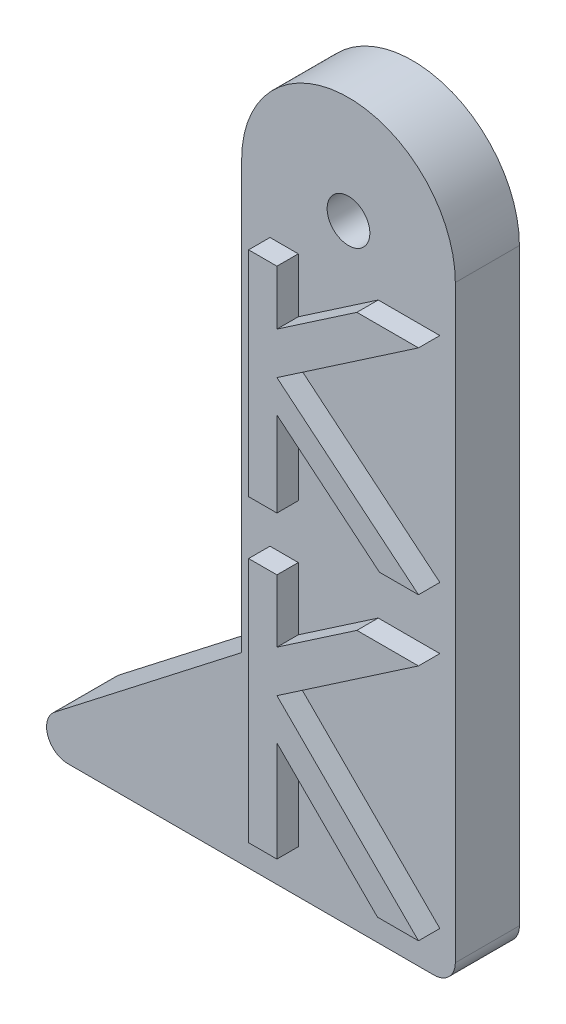
ISO-10303-21;
HEADER;
FILE_DESCRIPTION(('STEP AP214'),'2;1');
FILE_NAME('part.step','',(''),(''),'','','');
FILE_SCHEMA(('AUTOMOTIVE_DESIGN { 1 0 10303 214 1 1 1 1 }'));
ENDSEC;
DATA;
#1=APPLICATION_CONTEXT('core data for automotive mechanical design processes');
#2=APPLICATION_PROTOCOL_DEFINITION('international standard','automotive_design',2000,#1);
#3=PRODUCT_CONTEXT('',#1,'mechanical');
#4=PRODUCT('Part','Part','',(#3));
#5=PRODUCT_RELATED_PRODUCT_CATEGORY('part','',(#4));
#6=PRODUCT_DEFINITION_FORMATION('','',#4);
#7=PRODUCT_DEFINITION_CONTEXT('part definition',#1,'design');
#8=PRODUCT_DEFINITION('design','',#6,#7);
#9=PRODUCT_DEFINITION_SHAPE('','',#8);
#10=(LENGTH_UNIT() NAMED_UNIT(*) SI_UNIT(.MILLI.,.METRE.));
#11=(NAMED_UNIT(*) PLANE_ANGLE_UNIT() SI_UNIT($,.RADIAN.));
#12=(NAMED_UNIT(*) SI_UNIT($,.STERADIAN.) SOLID_ANGLE_UNIT());
#13=UNCERTAINTY_MEASURE_WITH_UNIT(LENGTH_MEASURE(1.E-05),#10,'distance_accuracy_value','');
#14=(GEOMETRIC_REPRESENTATION_CONTEXT(3) GLOBAL_UNCERTAINTY_ASSIGNED_CONTEXT((#13)) GLOBAL_UNIT_ASSIGNED_CONTEXT((#10,
#11,#12)) REPRESENTATION_CONTEXT('',''));
#15=CARTESIAN_POINT('',(0.,0.,0.));
#16=DIRECTION('',(0.,0.,1.));
#17=DIRECTION('',(1.,0.,0.));
#18=AXIS2_PLACEMENT_3D('',#15,#16,#17);
#19=CARTESIAN_POINT('',(0.,0.,3.));
#20=DIRECTION('',(0.,0.,1.));
#21=DIRECTION('',(1.,0.,0.));
#22=AXIS2_PLACEMENT_3D('',#19,#20,#21);
#23=PLANE('',#22);
#24=DIRECTION('',(1.,0.,0.));
#25=VECTOR('',#24,1.);
#26=CARTESIAN_POINT('',(0.,-28.5715056715313,3.));
#27=LINE('',#26,#25);
#28=CARTESIAN_POINT('',(-13.1319402109181,-28.5715056715313,3.));
#29=VERTEX_POINT('',#28);
#30=CARTESIAN_POINT('',(4.,-28.5715056715313,3.));
#31=VERTEX_POINT('',#30);
#32=EDGE_CURVE('E357',#29,#31,#27,.T.);
#33=ORIENTED_EDGE('',*,*,#32,.T.);
#34=CARTESIAN_POINT('',(4.,-27.5715056715313,3.));
#35=DIRECTION('',(0.,0.,1.));
#36=DIRECTION('',(1.,0.,0.));
#37=AXIS2_PLACEMENT_3D('',#34,#35,#36);
#38=CIRCLE('',#37,1.);
#39=CARTESIAN_POINT('',(5.,-27.5715056715313,3.));
#40=VERTEX_POINT('',#39);
#41=EDGE_CURVE('E406',#31,#40,#38,.T.);
#42=ORIENTED_EDGE('',*,*,#41,.T.);
#43=DIRECTION('',(0.,1.,0.));
#44=VECTOR('',#43,1.);
#45=CARTESIAN_POINT('',(5.,-20.,3.));
#46=LINE('',#45,#44);
#47=CARTESIAN_POINT('',(5.,0.,3.));
#48=VERTEX_POINT('',#47);
#49=EDGE_CURVE('E376',#40,#48,#46,.T.);
#50=ORIENTED_EDGE('',*,*,#49,.T.);
#51=CARTESIAN_POINT('',(0.,0.,3.));
#52=DIRECTION('',(0.,0.,1.));
#53=DIRECTION('',(1.,0.,0.));
#54=AXIS2_PLACEMENT_3D('',#51,#52,#53);
#55=CIRCLE('',#54,5.);
#56=CARTESIAN_POINT('',(-5.,0.,3.));
#57=VERTEX_POINT('',#56);
#58=EDGE_CURVE('E370',#48,#57,#55,.T.);
#59=ORIENTED_EDGE('',*,*,#58,.T.);
#60=DIRECTION('',(0.,-1.,0.));
#61=VECTOR('',#60,1.);
#62=CARTESIAN_POINT('',(-5.,0.,3.));
#63=LINE('',#62,#61);
#64=CARTESIAN_POINT('',(-5.,-20.,3.));
#65=VERTEX_POINT('',#64);
#66=EDGE_CURVE('E373',#57,#65,#63,.T.);
#67=ORIENTED_EDGE('',*,*,#66,.T.);
#68=DIRECTION('',(-0.790235889181246,-0.612802773696338,0.));
#69=VECTOR('',#68,1.);
#70=CARTESIAN_POINT('',(7.80753869804357,-10.0681614871782,3.));
#71=LINE('',#70,#69);
#72=CARTESIAN_POINT('',(-13.7447429846144,-26.78126978235,3.));
#73=VERTEX_POINT('',#72);
#74=EDGE_CURVE('E353',#65,#73,#71,.T.);
#75=ORIENTED_EDGE('',*,*,#74,.T.);
#76=CARTESIAN_POINT('',(-13.1319402109181,-27.5715056715313,3.));
#77=DIRECTION('',(0.,0.,1.));
#78=DIRECTION('',(1.,0.,0.));
#79=AXIS2_PLACEMENT_3D('',#76,#77,#78);
#80=CIRCLE('',#79,1.);
#81=EDGE_CURVE('E396',#73,#29,#80,.T.);
#82=ORIENTED_EDGE('',*,*,#81,.T.);
#83=EDGE_LOOP('',(#33,#42,#50,#59,#67,#75,#82));
#84=FACE_BOUND('',#83,.T.);
#85=CARTESIAN_POINT('',(0.,0.,3.));
#86=DIRECTION('',(0.,0.,1.));
#87=DIRECTION('',(1.,0.,0.));
#88=AXIS2_PLACEMENT_3D('',#85,#86,#87);
#89=CIRCLE('',#88,1.);
#90=CARTESIAN_POINT('',(1.,0.,3.));
#91=VERTEX_POINT('',#90);
#92=EDGE_CURVE('E364',#91,#91,#89,.T.);
#93=ORIENTED_EDGE('',*,*,#92,.F.);
#94=EDGE_LOOP('',(#93));
#95=FACE_BOUND('',#94,.T.);
#96=DIRECTION('',(0.,-1.,0.));
#97=VECTOR('',#96,1.);
#98=CARTESIAN_POINT('',(-3.67498817564403,-2.51040248948641,3.));
#99=LINE('',#98,#97);
#100=CARTESIAN_POINT('',(-3.67498817564403,-2.51040248948641,3.));
#101=VERTEX_POINT('',#100);
#102=CARTESIAN_POINT('',(-3.67498817564403,-12.5168149320241,3.));
#103=VERTEX_POINT('',#102);
#104=EDGE_CURVE('E255',#101,#103,#99,.T.);
#105=ORIENTED_EDGE('',*,*,#104,.F.);
#106=DIRECTION('',(-1.,0.,0.));
#107=VECTOR('',#106,1.);
#108=CARTESIAN_POINT('',(-2.34993812617557,-2.51040248948641,3.));
#109=LINE('',#108,#107);
#110=CARTESIAN_POINT('',(-2.34993812617557,-2.51040248948641,3.));
#111=VERTEX_POINT('',#110);
#112=EDGE_CURVE('E252',#111,#101,#109,.T.);
#113=ORIENTED_EDGE('',*,*,#112,.F.);
#114=DIRECTION('',(0.,1.,0.));
#115=VECTOR('',#114,1.);
#116=CARTESIAN_POINT('',(-2.34993812617557,-5.0620010293021,3.));
#117=LINE('',#116,#115);
#118=CARTESIAN_POINT('',(-2.34993812617557,-5.0620010293021,3.));
#119=VERTEX_POINT('',#118);
#120=EDGE_CURVE('E285',#119,#111,#117,.T.);
#121=ORIENTED_EDGE('',*,*,#120,.F.);
#122=DIRECTION('',(-0.826244564580546,-0.563311565211565,0.));
#123=VECTOR('',#122,1.);
#124=CARTESIAN_POINT('',(1.39265221762922,-2.51040248948641,3.));
#125=LINE('',#124,#123);
#126=CARTESIAN_POINT('',(1.39265221762922,-2.51040248948641,3.));
#127=VERTEX_POINT('',#126);
#128=EDGE_CURVE('E321',#127,#119,#125,.T.);
#129=ORIENTED_EDGE('',*,*,#128,.F.);
#130=DIRECTION('',(-1.,0.,0.));
#131=VECTOR('',#130,1.);
#132=CARTESIAN_POINT('',(4.27531212116673,-2.51040248948641,3.));
#133=LINE('',#132,#131);
#134=CARTESIAN_POINT('',(4.27531212116673,-2.51040248948641,3.));
#135=VERTEX_POINT('',#134);
#136=EDGE_CURVE('E319',#135,#127,#133,.T.);
#137=ORIENTED_EDGE('',*,*,#136,.F.);
#138=DIRECTION('',(0.826244564580547,0.563311565211565,0.));
#139=VECTOR('',#138,1.);
#140=CARTESIAN_POINT('',(-2.34993812617557,-7.02732186994047,3.));
#141=LINE('',#140,#139);
#142=CARTESIAN_POINT('',(-2.34993812617557,-7.02732186994047,3.));
#143=VERTEX_POINT('',#142);
#144=EDGE_CURVE('E317',#143,#135,#141,.T.);
#145=ORIENTED_EDGE('',*,*,#144,.F.);
#146=DIRECTION('',(-0.770021560905562,0.638017864750323,0.));
#147=VECTOR('',#146,1.);
#148=CARTESIAN_POINT('',(4.27531212116673,-12.5168149320241,3.));
#149=LINE('',#148,#147);
#150=CARTESIAN_POINT('',(4.27531212116673,-12.5168149320241,3.));
#151=VERTEX_POINT('',#150);
#152=EDGE_CURVE('E315',#151,#143,#149,.T.);
#153=ORIENTED_EDGE('',*,*,#152,.F.);
#154=DIRECTION('',(1.,0.,0.));
#155=VECTOR('',#154,1.);
#156=CARTESIAN_POINT('',(2.44765688052057,-12.5168149320241,3.));
#157=LINE('',#156,#155);
#158=CARTESIAN_POINT('',(2.44765688052057,-12.5168149320241,3.));
#159=VERTEX_POINT('',#158);
#160=EDGE_CURVE('E313',#159,#151,#157,.T.);
#161=ORIENTED_EDGE('',*,*,#160,.F.);
#162=DIRECTION('',(0.770021560905562,-0.638017864750323,0.));
#163=VECTOR('',#162,1.);
#164=CARTESIAN_POINT('',(-2.34993812617557,-8.54166478361871,3.));
#165=LINE('',#164,#163);
#166=CARTESIAN_POINT('',(-2.34993812617557,-8.54166478361871,3.));
#167=VERTEX_POINT('',#166);
#168=EDGE_CURVE('E311',#167,#159,#165,.T.);
#169=ORIENTED_EDGE('',*,*,#168,.F.);
#170=DIRECTION('',(0.,1.,0.));
#171=VECTOR('',#170,1.);
#172=CARTESIAN_POINT('',(-2.34993812617557,-12.5168149320241,3.));
#173=LINE('',#172,#171);
#174=CARTESIAN_POINT('',(-2.34993812617557,-12.5168149320241,3.));
#175=VERTEX_POINT('',#174);
#176=EDGE_CURVE('E309',#175,#167,#173,.T.);
#177=ORIENTED_EDGE('',*,*,#176,.F.);
#178=DIRECTION('',(1.,0.,0.));
#179=VECTOR('',#178,1.);
#180=CARTESIAN_POINT('',(-3.67498817564403,-12.5168149320241,3.));
#181=LINE('',#180,#179);
#182=EDGE_CURVE('E307',#103,#175,#181,.T.);
#183=ORIENTED_EDGE('',*,*,#182,.F.);
#184=EDGE_LOOP('',(#105,#113,#121,#129,#137,#145,#153,#161,#169,#177,#183));
#185=FACE_BOUND('',#184,.T.);
#186=DIRECTION('',(0.,-1.,0.));
#187=VECTOR('',#186,1.);
#188=CARTESIAN_POINT('',(-3.67498817564403,-15.023538628462,3.));
#189=LINE('',#188,#187);
#190=CARTESIAN_POINT('',(-3.67498817564403,-15.023538628462,3.));
#191=VERTEX_POINT('',#190);
#192=CARTESIAN_POINT('',(-3.67498817564403,-26.5440689039833,3.));
#193=VERTEX_POINT('',#192);
#194=EDGE_CURVE('E251',#191,#193,#189,.T.);
#195=ORIENTED_EDGE('',*,*,#194,.F.);
#196=DIRECTION('',(-1.,0.,0.));
#197=VECTOR('',#196,1.);
#198=CARTESIAN_POINT('',(-2.34993812617557,-15.023538628462,3.));
#199=LINE('',#198,#197);
#200=CARTESIAN_POINT('',(-2.34993812617557,-15.023538628462,3.));
#201=VERTEX_POINT('',#200);
#202=EDGE_CURVE('E245',#201,#191,#199,.T.);
#203=ORIENTED_EDGE('',*,*,#202,.F.);
#204=DIRECTION('',(0.,1.,0.));
#205=VECTOR('',#204,1.);
#206=CARTESIAN_POINT('',(-2.34993812617557,-17.9534978160028,3.));
#207=LINE('',#206,#205);
#208=CARTESIAN_POINT('',(-2.34993812617557,-17.9534978160028,3.));
#209=VERTEX_POINT('',#208);
#210=EDGE_CURVE('E230',#209,#201,#207,.T.);
#211=ORIENTED_EDGE('',*,*,#210,.F.);
#212=DIRECTION('',(-0.826244564580546,-0.563311565211565,0.));
#213=VECTOR('',#212,1.);
#214=CARTESIAN_POINT('',(1.39265221762922,-15.4018992761871,3.));
#215=LINE('',#214,#213);
#216=CARTESIAN_POINT('',(1.39265221762922,-15.4018992761871,3.));
#217=VERTEX_POINT('',#216);
#218=EDGE_CURVE('E238',#217,#209,#215,.T.);
#219=ORIENTED_EDGE('',*,*,#218,.F.);
#220=DIRECTION('',(-1.,0.,0.));
#221=VECTOR('',#220,1.);
#222=CARTESIAN_POINT('',(4.27531212116673,-15.4018992761871,3.));
#223=LINE('',#222,#221);
#224=CARTESIAN_POINT('',(4.27531212116673,-15.4018992761871,3.));
#225=VERTEX_POINT('',#224);
#226=EDGE_CURVE('E898',#225,#217,#223,.T.);
#227=ORIENTED_EDGE('',*,*,#226,.F.);
#228=DIRECTION('',(0.826244564580547,0.563311565211565,0.));
#229=VECTOR('',#228,1.);
#230=CARTESIAN_POINT('',(-2.34993812617557,-19.9188186566411,3.));
#231=LINE('',#230,#229);
#232=CARTESIAN_POINT('',(-2.34993812617557,-19.9188186566411,3.));
#233=VERTEX_POINT('',#232);
#234=EDGE_CURVE('E900',#233,#225,#231,.T.);
#235=ORIENTED_EDGE('',*,*,#234,.F.);
#236=DIRECTION('',(-0.707106781186554,0.707106781186541,0.));
#237=VECTOR('',#236,1.);
#238=CARTESIAN_POINT('',(4.27531212116673,-26.5440689039833,3.));
#239=LINE('',#238,#237);
#240=CARTESIAN_POINT('',(4.27531212116673,-26.5440689039833,3.));
#241=VERTEX_POINT('',#240);
#242=EDGE_CURVE('E902',#241,#233,#239,.T.);
#243=ORIENTED_EDGE('',*,*,#242,.F.);
#244=DIRECTION('',(1.,0.,0.));
#245=VECTOR('',#244,1.);
#246=CARTESIAN_POINT('',(2.35627411848835,-26.5440689039833,3.));
#247=LINE('',#246,#245);
#248=CARTESIAN_POINT('',(2.35627411848835,-26.5440689039833,3.));
#249=VERTEX_POINT('',#248);
#250=EDGE_CURVE('E904',#249,#241,#247,.T.);
#251=ORIENTED_EDGE('',*,*,#250,.F.);
#252=DIRECTION('',(0.707106781186554,-0.707106781186541,0.));
#253=VECTOR('',#252,1.);
#254=CARTESIAN_POINT('',(-2.34993812617557,-21.8378566593195,3.));
#255=LINE('',#254,#253);
#256=CARTESIAN_POINT('',(-2.34993812617557,-21.8378566593195,3.));
#257=VERTEX_POINT('',#256);
#258=EDGE_CURVE('E906',#257,#249,#255,.T.);
#259=ORIENTED_EDGE('',*,*,#258,.F.);
#260=DIRECTION('',(0.,1.,0.));
#261=VECTOR('',#260,1.);
#262=CARTESIAN_POINT('',(-2.34993812617557,-26.5440689039833,3.));
#263=LINE('',#262,#261);
#264=CARTESIAN_POINT('',(-2.34993812617557,-26.5440689039833,3.));
#265=VERTEX_POINT('',#264);
#266=EDGE_CURVE('E908',#265,#257,#263,.T.);
#267=ORIENTED_EDGE('',*,*,#266,.F.);
#268=DIRECTION('',(1.,0.,0.));
#269=VECTOR('',#268,1.);
#270=CARTESIAN_POINT('',(-3.67498817564403,-26.5440689039833,3.));
#271=LINE('',#270,#269);
#272=EDGE_CURVE('E257',#193,#265,#271,.T.);
#273=ORIENTED_EDGE('',*,*,#272,.F.);
#274=EDGE_LOOP('',(#195,#203,#211,#219,#227,#235,#243,#251,#259,#267,#273));
#275=FACE_BOUND('',#274,.T.);
#276=ADVANCED_FACE('F39',(#84,#95,#185,#275),#23,.T.);
#277=CARTESIAN_POINT('',(0.,0.,0.));
#278=DIRECTION('',(0.,0.,1.));
#279=DIRECTION('',(1.,0.,0.));
#280=AXIS2_PLACEMENT_3D('',#277,#278,#279);
#281=PLANE('',#280);
#282=DIRECTION('',(0.,1.,0.));
#283=VECTOR('',#282,1.);
#284=CARTESIAN_POINT('',(5.,-20.,0.));
#285=LINE('',#284,#283);
#286=CARTESIAN_POINT('',(5.,-27.5715056715313,0.));
#287=VERTEX_POINT('',#286);
#288=CARTESIAN_POINT('',(5.,0.,0.));
#289=VERTEX_POINT('',#288);
#290=EDGE_CURVE('E374',#287,#289,#285,.T.);
#291=ORIENTED_EDGE('',*,*,#290,.F.);
#292=CARTESIAN_POINT('',(4.,-27.5715056715313,0.));
#293=DIRECTION('',(0.,0.,1.));
#294=DIRECTION('',(1.,0.,0.));
#295=AXIS2_PLACEMENT_3D('',#292,#293,#294);
#296=CIRCLE('',#295,1.);
#297=CARTESIAN_POINT('',(4.,-28.5715056715313,0.));
#298=VERTEX_POINT('',#297);
#299=EDGE_CURVE('E11',#287,#298,#296,.F.);
#300=ORIENTED_EDGE('',*,*,#299,.T.);
#301=DIRECTION('',(-1.,0.,0.));
#302=VECTOR('',#301,1.);
#303=CARTESIAN_POINT('',(0.,-28.5715056715313,0.));
#304=LINE('',#303,#302);
#305=CARTESIAN_POINT('',(-13.1319402109181,-28.5715056715313,0.));
#306=VERTEX_POINT('',#305);
#307=EDGE_CURVE('E356',#298,#306,#304,.T.);
#308=ORIENTED_EDGE('',*,*,#307,.T.);
#309=CARTESIAN_POINT('',(-13.1319402109181,-27.5715056715313,0.));
#310=DIRECTION('',(0.,0.,1.));
#311=DIRECTION('',(1.,0.,0.));
#312=AXIS2_PLACEMENT_3D('',#309,#310,#311);
#313=CIRCLE('',#312,1.);
#314=CARTESIAN_POINT('',(-13.7447429846144,-26.78126978235,0.));
#315=VERTEX_POINT('',#314);
#316=EDGE_CURVE('E401',#306,#315,#313,.F.);
#317=ORIENTED_EDGE('',*,*,#316,.T.);
#318=DIRECTION('',(0.790235889181246,0.612802773696338,0.));
#319=VECTOR('',#318,1.);
#320=CARTESIAN_POINT('',(7.80753869804357,-10.0681614871782,0.));
#321=LINE('',#320,#319);
#322=CARTESIAN_POINT('',(-5.,-20.,0.));
#323=VERTEX_POINT('',#322);
#324=EDGE_CURVE('E354',#315,#323,#321,.T.);
#325=ORIENTED_EDGE('',*,*,#324,.T.);
#326=DIRECTION('',(0.,-1.,0.));
#327=VECTOR('',#326,1.);
#328=CARTESIAN_POINT('',(-5.,0.,0.));
#329=LINE('',#328,#327);
#330=CARTESIAN_POINT('',(-5.,0.,0.));
#331=VERTEX_POINT('',#330);
#332=EDGE_CURVE('E381',#331,#323,#329,.T.);
#333=ORIENTED_EDGE('',*,*,#332,.F.);
#334=CARTESIAN_POINT('',(0.,0.,0.));
#335=DIRECTION('',(0.,0.,1.));
#336=DIRECTION('',(1.,0.,0.));
#337=AXIS2_PLACEMENT_3D('',#334,#335,#336);
#338=CIRCLE('',#337,5.);
#339=EDGE_CURVE('E367',#289,#331,#338,.T.);
#340=ORIENTED_EDGE('',*,*,#339,.F.);
#341=EDGE_LOOP('',(#291,#300,#308,#317,#325,#333,#340));
#342=FACE_BOUND('',#341,.T.);
#343=CARTESIAN_POINT('',(0.,0.,0.));
#344=DIRECTION('',(0.,0.,1.));
#345=DIRECTION('',(1.,0.,0.));
#346=AXIS2_PLACEMENT_3D('',#343,#344,#345);
#347=CIRCLE('',#346,1.);
#348=CARTESIAN_POINT('',(1.,0.,0.));
#349=VERTEX_POINT('',#348);
#350=EDGE_CURVE('E363',#349,#349,#347,.T.);
#351=ORIENTED_EDGE('',*,*,#350,.T.);
#352=EDGE_LOOP('',(#351));
#353=FACE_BOUND('',#352,.T.);
#354=ADVANCED_FACE('F417',(#342,#353),#281,.F.);
#355=CARTESIAN_POINT('',(0.,0.,3.));
#356=DIRECTION('',(0.,0.,-1.));
#357=DIRECTION('',(-1.,0.,0.));
#358=AXIS2_PLACEMENT_3D('',#355,#356,#357);
#359=CYLINDRICAL_SURFACE('',#358,5.);
#360=ORIENTED_EDGE('',*,*,#339,.T.);
#361=DIRECTION('',(0.,0.,-1.));
#362=VECTOR('',#361,1.);
#363=CARTESIAN_POINT('',(-5.,0.,3.));
#364=LINE('',#363,#362);
#365=EDGE_CURVE('E390',#57,#331,#364,.T.);
#366=ORIENTED_EDGE('',*,*,#365,.F.);
#367=ORIENTED_EDGE('',*,*,#58,.F.);
#368=DIRECTION('',(0.,0.,-1.));
#369=VECTOR('',#368,1.);
#370=CARTESIAN_POINT('',(5.,0.,3.));
#371=LINE('',#370,#369);
#372=EDGE_CURVE('E378',#48,#289,#371,.T.);
#373=ORIENTED_EDGE('',*,*,#372,.T.);
#374=EDGE_LOOP('',(#360,#366,#367,#373));
#375=FACE_BOUND('',#374,.T.);
#376=ADVANCED_FACE('F441',(#375),#359,.T.);
#377=CARTESIAN_POINT('',(-5.,0.,3.));
#378=DIRECTION('',(1.,0.,0.));
#379=DIRECTION('',(0.,1.,0.));
#380=AXIS2_PLACEMENT_3D('',#377,#378,#379);
#381=PLANE('',#380);
#382=ORIENTED_EDGE('',*,*,#332,.T.);
#383=DIRECTION('',(0.,0.,-1.));
#384=VECTOR('',#383,1.);
#385=CARTESIAN_POINT('',(-5.,-20.,3.));
#386=LINE('',#385,#384);
#387=EDGE_CURVE('E387',#65,#323,#386,.T.);
#388=ORIENTED_EDGE('',*,*,#387,.F.);
#389=ORIENTED_EDGE('',*,*,#66,.F.);
#390=ORIENTED_EDGE('',*,*,#365,.T.);
#391=EDGE_LOOP('',(#382,#388,#389,#390));
#392=FACE_BOUND('',#391,.T.);
#393=ADVANCED_FACE('F437',(#392),#381,.F.);
#394=CARTESIAN_POINT('',(5.,-20.,3.));
#395=DIRECTION('',(-1.,0.,0.));
#396=DIRECTION('',(0.,-1.,0.));
#397=AXIS2_PLACEMENT_3D('',#394,#395,#396);
#398=PLANE('',#397);
#399=ORIENTED_EDGE('',*,*,#49,.F.);
#400=DIRECTION('',(0.,0.,1.));
#401=VECTOR('',#400,1.);
#402=CARTESIAN_POINT('',(5.,-27.5715056715313,0.));
#403=LINE('',#402,#401);
#404=EDGE_CURVE('E47',#40,#287,#403,.F.);
#405=ORIENTED_EDGE('',*,*,#404,.T.);
#406=ORIENTED_EDGE('',*,*,#290,.T.);
#407=ORIENTED_EDGE('',*,*,#372,.F.);
#408=EDGE_LOOP('',(#399,#405,#406,#407));
#409=FACE_BOUND('',#408,.T.);
#410=ADVANCED_FACE('F411',(#409),#398,.F.);
#411=CARTESIAN_POINT('',(0.,0.,3.));
#412=DIRECTION('',(0.,0.,-1.));
#413=DIRECTION('',(-1.,0.,0.));
#414=AXIS2_PLACEMENT_3D('',#411,#412,#413);
#415=CYLINDRICAL_SURFACE('',#414,1.);
#416=ORIENTED_EDGE('',*,*,#92,.T.);
#417=EDGE_LOOP('',(#416));
#418=FACE_BOUND('',#417,.T.);
#419=ORIENTED_EDGE('',*,*,#350,.F.);
#420=EDGE_LOOP('',(#419));
#421=FACE_BOUND('',#420,.T.);
#422=ADVANCED_FACE('F455',(#418,#421),#415,.F.);
#423=CARTESIAN_POINT('',(7.80753869804357,-10.0681614871782,-22.73133128622));
#424=DIRECTION('',(-0.612802773696338,0.790235889181246,0.));
#425=DIRECTION('',(-0.790235889181246,-0.612802773696338,0.));
#426=AXIS2_PLACEMENT_3D('',#423,#424,#425);
#427=PLANE('',#426);
#428=ORIENTED_EDGE('',*,*,#324,.F.);
#429=DIRECTION('',(0.,0.,1.));
#430=VECTOR('',#429,1.);
#431=CARTESIAN_POINT('',(-13.7447429846144,-26.78126978235,-22.73133128622));
#432=LINE('',#431,#430);
#433=EDGE_CURVE('E393',#315,#73,#432,.T.);
#434=ORIENTED_EDGE('',*,*,#433,.T.);
#435=ORIENTED_EDGE('',*,*,#74,.F.);
#436=ORIENTED_EDGE('',*,*,#387,.T.);
#437=EDGE_LOOP('',(#428,#434,#435,#436));
#438=FACE_BOUND('',#437,.T.);
#439=ADVANCED_FACE('F434',(#438),#427,.T.);
#440=CARTESIAN_POINT('',(0.,-28.5715056715313,-22.73133128622));
#441=DIRECTION('',(0.,-1.,0.));
#442=DIRECTION('',(0.,0.,-1.));
#443=AXIS2_PLACEMENT_3D('',#440,#441,#442);
#444=PLANE('',#443);
#445=ORIENTED_EDGE('',*,*,#307,.F.);
#446=DIRECTION('',(0.,0.,1.));
#447=VECTOR('',#446,1.);
#448=CARTESIAN_POINT('',(4.,-28.5715056715313,3.));
#449=LINE('',#448,#447);
#450=EDGE_CURVE('E403',#298,#31,#449,.T.);
#451=ORIENTED_EDGE('',*,*,#450,.T.);
#452=ORIENTED_EDGE('',*,*,#32,.F.);
#453=DIRECTION('',(0.,0.,1.));
#454=VECTOR('',#453,1.);
#455=CARTESIAN_POINT('',(-13.1319402109181,-28.5715056715313,-22.73133128622));
#456=LINE('',#455,#454);
#457=EDGE_CURVE('E398',#29,#306,#456,.F.);
#458=ORIENTED_EDGE('',*,*,#457,.T.);
#459=EDGE_LOOP('',(#445,#451,#452,#458));
#460=FACE_BOUND('',#459,.T.);
#461=ADVANCED_FACE('F423',(#460),#444,.T.);
#462=CARTESIAN_POINT('',(-13.1319402109181,-27.5715056715313,-22.73133128622));
#463=DIRECTION('',(0.,0.,1.));
#464=DIRECTION('',(1.,0.,0.));
#465=AXIS2_PLACEMENT_3D('',#462,#463,#464);
#466=CYLINDRICAL_SURFACE('',#465,1.);
#467=ORIENTED_EDGE('',*,*,#316,.F.);
#468=ORIENTED_EDGE('',*,*,#457,.F.);
#469=ORIENTED_EDGE('',*,*,#81,.F.);
#470=ORIENTED_EDGE('',*,*,#433,.F.);
#471=EDGE_LOOP('',(#467,#468,#469,#470));
#472=FACE_BOUND('',#471,.T.);
#473=ADVANCED_FACE('F431',(#472),#466,.T.);
#474=CARTESIAN_POINT('',(4.,-27.5715056715313,-22.73133128622));
#475=DIRECTION('',(0.,0.,-1.));
#476=DIRECTION('',(-1.,0.,0.));
#477=AXIS2_PLACEMENT_3D('',#474,#475,#476);
#478=CYLINDRICAL_SURFACE('',#477,1.);
#479=ORIENTED_EDGE('',*,*,#299,.F.);
#480=ORIENTED_EDGE('',*,*,#404,.F.);
#481=ORIENTED_EDGE('',*,*,#41,.F.);
#482=ORIENTED_EDGE('',*,*,#450,.F.);
#483=EDGE_LOOP('',(#479,#480,#481,#482));
#484=FACE_BOUND('',#483,.T.);
#485=ADVANCED_FACE('F41',(#484),#478,.T.);
#486=CARTESIAN_POINT('',(-2.34993812617557,-2.51040248948641,4.));
#487=DIRECTION('',(0.,-1.,0.));
#488=DIRECTION('',(0.,0.,-1.));
#489=AXIS2_PLACEMENT_3D('',#486,#487,#488);
#490=PLANE('',#489);
#491=ORIENTED_EDGE('',*,*,#112,.T.);
#492=DIRECTION('',(0.,0.,-1.));
#493=VECTOR('',#492,1.);
#494=CARTESIAN_POINT('',(-3.67498817564403,-2.51040248948641,4.));
#495=LINE('',#494,#493);
#496=CARTESIAN_POINT('',(-3.67498817564403,-2.51040248948641,4.));
#497=VERTEX_POINT('',#496);
#498=EDGE_CURVE('E351',#497,#101,#495,.T.);
#499=ORIENTED_EDGE('',*,*,#498,.F.);
#500=DIRECTION('',(-1.,0.,0.));
#501=VECTOR('',#500,1.);
#502=CARTESIAN_POINT('',(-2.34993812617557,-2.51040248948641,4.));
#503=LINE('',#502,#501);
#504=CARTESIAN_POINT('',(-2.34993812617557,-2.51040248948641,4.));
#505=VERTEX_POINT('',#504);
#506=EDGE_CURVE('E281',#505,#497,#503,.T.);
#507=ORIENTED_EDGE('',*,*,#506,.F.);
#508=DIRECTION('',(0.,0.,-1.));
#509=VECTOR('',#508,1.);
#510=CARTESIAN_POINT('',(-2.34993812617557,-2.51040248948641,4.));
#511=LINE('',#510,#509);
#512=EDGE_CURVE('E304',#505,#111,#511,.T.);
#513=ORIENTED_EDGE('',*,*,#512,.T.);
#514=EDGE_LOOP('',(#491,#499,#507,#513));
#515=FACE_BOUND('',#514,.T.);
#516=ADVANCED_FACE('F490',(#515),#490,.F.);
#517=CARTESIAN_POINT('',(-3.67498817564403,-2.51040248948641,4.));
#518=DIRECTION('',(1.,0.,0.));
#519=DIRECTION('',(0.,0.,-1.));
#520=AXIS2_PLACEMENT_3D('',#517,#518,#519);
#521=PLANE('',#520);
#522=ORIENTED_EDGE('',*,*,#104,.T.);
#523=DIRECTION('',(0.,0.,-1.));
#524=VECTOR('',#523,1.);
#525=CARTESIAN_POINT('',(-3.67498817564403,-12.5168149320241,4.));
#526=LINE('',#525,#524);
#527=CARTESIAN_POINT('',(-3.67498817564403,-12.5168149320241,4.));
#528=VERTEX_POINT('',#527);
#529=EDGE_CURVE('E348',#528,#103,#526,.T.);
#530=ORIENTED_EDGE('',*,*,#529,.F.);
#531=DIRECTION('',(0.,-1.,0.));
#532=VECTOR('',#531,1.);
#533=CARTESIAN_POINT('',(-3.67498817564403,-2.51040248948641,4.));
#534=LINE('',#533,#532);
#535=EDGE_CURVE('E284',#497,#528,#534,.T.);
#536=ORIENTED_EDGE('',*,*,#535,.F.);
#537=ORIENTED_EDGE('',*,*,#498,.T.);
#538=EDGE_LOOP('',(#522,#530,#536,#537));
#539=FACE_BOUND('',#538,.T.);
#540=ADVANCED_FACE('F477',(#539),#521,.F.);
#541=CARTESIAN_POINT('',(-3.67498817564403,-12.5168149320241,4.));
#542=DIRECTION('',(0.,1.,0.));
#543=DIRECTION('',(0.,0.,1.));
#544=AXIS2_PLACEMENT_3D('',#541,#542,#543);
#545=PLANE('',#544);
#546=ORIENTED_EDGE('',*,*,#182,.T.);
#547=DIRECTION('',(0.,0.,-1.));
#548=VECTOR('',#547,1.);
#549=CARTESIAN_POINT('',(-2.34993812617557,-12.5168149320241,4.));
#550=LINE('',#549,#548);
#551=CARTESIAN_POINT('',(-2.34993812617557,-12.5168149320241,4.));
#552=VERTEX_POINT('',#551);
#553=EDGE_CURVE('E345',#552,#175,#550,.T.);
#554=ORIENTED_EDGE('',*,*,#553,.F.);
#555=DIRECTION('',(1.,0.,0.));
#556=VECTOR('',#555,1.);
#557=CARTESIAN_POINT('',(-3.67498817564403,-12.5168149320241,4.));
#558=LINE('',#557,#556);
#559=EDGE_CURVE('E287',#528,#552,#558,.T.);
#560=ORIENTED_EDGE('',*,*,#559,.F.);
#561=ORIENTED_EDGE('',*,*,#529,.T.);
#562=EDGE_LOOP('',(#546,#554,#560,#561));
#563=FACE_BOUND('',#562,.T.);
#564=ADVANCED_FACE('F481',(#563),#545,.F.);
#565=CARTESIAN_POINT('',(-2.34993812617557,-12.5168149320241,4.));
#566=DIRECTION('',(-1.,0.,0.));
#567=DIRECTION('',(0.,0.,1.));
#568=AXIS2_PLACEMENT_3D('',#565,#566,#567);
#569=PLANE('',#568);
#570=ORIENTED_EDGE('',*,*,#176,.T.);
#571=DIRECTION('',(0.,0.,-1.));
#572=VECTOR('',#571,1.);
#573=CARTESIAN_POINT('',(-2.34993812617557,-8.54166478361871,4.));
#574=LINE('',#573,#572);
#575=CARTESIAN_POINT('',(-2.34993812617557,-8.54166478361871,4.));
#576=VERTEX_POINT('',#575);
#577=EDGE_CURVE('E342',#576,#167,#574,.T.);
#578=ORIENTED_EDGE('',*,*,#577,.F.);
#579=DIRECTION('',(0.,1.,0.));
#580=VECTOR('',#579,1.);
#581=CARTESIAN_POINT('',(-2.34993812617557,-12.5168149320241,4.));
#582=LINE('',#581,#580);
#583=EDGE_CURVE('E289',#552,#576,#582,.T.);
#584=ORIENTED_EDGE('',*,*,#583,.F.);
#585=ORIENTED_EDGE('',*,*,#553,.T.);
#586=EDGE_LOOP('',(#570,#578,#584,#585));
#587=FACE_BOUND('',#586,.T.);
#588=ADVANCED_FACE('F522',(#587),#569,.F.);
#589=CARTESIAN_POINT('',(-2.34993812617557,-8.54166478361871,4.));
#590=DIRECTION('',(0.638017864750323,0.770021560905562,0.));
#591=DIRECTION('',(-0.770021560905562,0.638017864750323,0.));
#592=AXIS2_PLACEMENT_3D('',#589,#590,#591);
#593=PLANE('',#592);
#594=ORIENTED_EDGE('',*,*,#168,.T.);
#595=DIRECTION('',(0.,0.,-1.));
#596=VECTOR('',#595,1.);
#597=CARTESIAN_POINT('',(2.44765688052057,-12.5168149320241,4.));
#598=LINE('',#597,#596);
#599=CARTESIAN_POINT('',(2.44765688052057,-12.5168149320241,4.));
#600=VERTEX_POINT('',#599);
#601=EDGE_CURVE('E339',#600,#159,#598,.T.);
#602=ORIENTED_EDGE('',*,*,#601,.F.);
#603=DIRECTION('',(0.770021560905562,-0.638017864750323,0.));
#604=VECTOR('',#603,1.);
#605=CARTESIAN_POINT('',(-2.34993812617557,-8.54166478361871,4.));
#606=LINE('',#605,#604);
#607=EDGE_CURVE('E291',#576,#600,#606,.T.);
#608=ORIENTED_EDGE('',*,*,#607,.F.);
#609=ORIENTED_EDGE('',*,*,#577,.T.);
#610=EDGE_LOOP('',(#594,#602,#608,#609));
#611=FACE_BOUND('',#610,.T.);
#612=ADVANCED_FACE('F520',(#611),#593,.F.);
#613=CARTESIAN_POINT('',(2.44765688052057,-12.5168149320241,4.));
#614=DIRECTION('',(0.,1.,0.));
#615=DIRECTION('',(0.,0.,1.));
#616=AXIS2_PLACEMENT_3D('',#613,#614,#615);
#617=PLANE('',#616);
#618=ORIENTED_EDGE('',*,*,#160,.T.);
#619=DIRECTION('',(0.,0.,-1.));
#620=VECTOR('',#619,1.);
#621=CARTESIAN_POINT('',(4.27531212116673,-12.5168149320241,4.));
#622=LINE('',#621,#620);
#623=CARTESIAN_POINT('',(4.27531212116673,-12.5168149320241,4.));
#624=VERTEX_POINT('',#623);
#625=EDGE_CURVE('E336',#624,#151,#622,.T.);
#626=ORIENTED_EDGE('',*,*,#625,.F.);
#627=DIRECTION('',(1.,0.,0.));
#628=VECTOR('',#627,1.);
#629=CARTESIAN_POINT('',(2.44765688052057,-12.5168149320241,4.));
#630=LINE('',#629,#628);
#631=EDGE_CURVE('E293',#600,#624,#630,.T.);
#632=ORIENTED_EDGE('',*,*,#631,.F.);
#633=ORIENTED_EDGE('',*,*,#601,.T.);
#634=EDGE_LOOP('',(#618,#626,#632,#633));
#635=FACE_BOUND('',#634,.T.);
#636=ADVANCED_FACE('F516',(#635),#617,.F.);
#637=CARTESIAN_POINT('',(4.27531212116673,-12.5168149320241,4.));
#638=DIRECTION('',(-0.638017864750323,-0.770021560905562,0.));
#639=DIRECTION('',(0.770021560905562,-0.638017864750323,0.));
#640=AXIS2_PLACEMENT_3D('',#637,#638,#639);
#641=PLANE('',#640);
#642=ORIENTED_EDGE('',*,*,#152,.T.);
#643=DIRECTION('',(0.,0.,-1.));
#644=VECTOR('',#643,1.);
#645=CARTESIAN_POINT('',(-2.34993812617557,-7.02732186994047,4.));
#646=LINE('',#645,#644);
#647=CARTESIAN_POINT('',(-2.34993812617557,-7.02732186994047,4.));
#648=VERTEX_POINT('',#647);
#649=EDGE_CURVE('E333',#648,#143,#646,.T.);
#650=ORIENTED_EDGE('',*,*,#649,.F.);
#651=DIRECTION('',(-0.770021560905562,0.638017864750323,0.));
#652=VECTOR('',#651,1.);
#653=CARTESIAN_POINT('',(4.27531212116673,-12.5168149320241,4.));
#654=LINE('',#653,#652);
#655=EDGE_CURVE('E295',#624,#648,#654,.T.);
#656=ORIENTED_EDGE('',*,*,#655,.F.);
#657=ORIENTED_EDGE('',*,*,#625,.T.);
#658=EDGE_LOOP('',(#642,#650,#656,#657));
#659=FACE_BOUND('',#658,.T.);
#660=ADVANCED_FACE('F511',(#659),#641,.F.);
#661=CARTESIAN_POINT('',(-2.34993812617557,-7.02732186994047,4.));
#662=DIRECTION('',(-0.563311565211565,0.826244564580547,0.));
#663=DIRECTION('',(-0.826244564580547,-0.563311565211565,0.));
#664=AXIS2_PLACEMENT_3D('',#661,#662,#663);
#665=PLANE('',#664);
#666=ORIENTED_EDGE('',*,*,#144,.T.);
#667=DIRECTION('',(0.,0.,-1.));
#668=VECTOR('',#667,1.);
#669=CARTESIAN_POINT('',(4.27531212116673,-2.51040248948641,4.));
#670=LINE('',#669,#668);
#671=CARTESIAN_POINT('',(4.27531212116673,-2.51040248948641,4.));
#672=VERTEX_POINT('',#671);
#673=EDGE_CURVE('E330',#672,#135,#670,.T.);
#674=ORIENTED_EDGE('',*,*,#673,.F.);
#675=DIRECTION('',(0.826244564580547,0.563311565211565,0.));
#676=VECTOR('',#675,1.);
#677=CARTESIAN_POINT('',(-2.34993812617557,-7.02732186994047,4.));
#678=LINE('',#677,#676);
#679=EDGE_CURVE('E297',#648,#672,#678,.T.);
#680=ORIENTED_EDGE('',*,*,#679,.F.);
#681=ORIENTED_EDGE('',*,*,#649,.T.);
#682=EDGE_LOOP('',(#666,#674,#680,#681));
#683=FACE_BOUND('',#682,.T.);
#684=ADVANCED_FACE('F505',(#683),#665,.F.);
#685=CARTESIAN_POINT('',(4.27531212116673,-2.51040248948641,4.));
#686=DIRECTION('',(0.,-1.,0.));
#687=DIRECTION('',(0.,0.,-1.));
#688=AXIS2_PLACEMENT_3D('',#685,#686,#687);
#689=PLANE('',#688);
#690=ORIENTED_EDGE('',*,*,#136,.T.);
#691=DIRECTION('',(0.,0.,-1.));
#692=VECTOR('',#691,1.);
#693=CARTESIAN_POINT('',(1.39265221762922,-2.51040248948641,4.));
#694=LINE('',#693,#692);
#695=CARTESIAN_POINT('',(1.39265221762922,-2.51040248948641,4.));
#696=VERTEX_POINT('',#695);
#697=EDGE_CURVE('E327',#696,#127,#694,.T.);
#698=ORIENTED_EDGE('',*,*,#697,.F.);
#699=DIRECTION('',(-1.,0.,0.));
#700=VECTOR('',#699,1.);
#701=CARTESIAN_POINT('',(4.27531212116673,-2.51040248948641,4.));
#702=LINE('',#701,#700);
#703=EDGE_CURVE('E299',#672,#696,#702,.T.);
#704=ORIENTED_EDGE('',*,*,#703,.F.);
#705=ORIENTED_EDGE('',*,*,#673,.T.);
#706=EDGE_LOOP('',(#690,#698,#704,#705));
#707=FACE_BOUND('',#706,.T.);
#708=ADVANCED_FACE('F501',(#707),#689,.F.);
#709=CARTESIAN_POINT('',(1.39265221762922,-2.51040248948641,4.));
#710=DIRECTION('',(0.563311565211565,-0.826244564580546,0.));
#711=DIRECTION('',(0.826244564580546,0.563311565211565,0.));
#712=AXIS2_PLACEMENT_3D('',#709,#710,#711);
#713=PLANE('',#712);
#714=ORIENTED_EDGE('',*,*,#128,.T.);
#715=DIRECTION('',(0.,0.,-1.));
#716=VECTOR('',#715,1.);
#717=CARTESIAN_POINT('',(-2.34993812617557,-5.0620010293021,4.));
#718=LINE('',#717,#716);
#719=CARTESIAN_POINT('',(-2.34993812617557,-5.0620010293021,4.));
#720=VERTEX_POINT('',#719);
#721=EDGE_CURVE('E62',#720,#119,#718,.T.);
#722=ORIENTED_EDGE('',*,*,#721,.F.);
#723=DIRECTION('',(-0.826244564580546,-0.563311565211565,0.));
#724=VECTOR('',#723,1.);
#725=CARTESIAN_POINT('',(1.39265221762922,-2.51040248948641,4.));
#726=LINE('',#725,#724);
#727=EDGE_CURVE('E301',#696,#720,#726,.T.);
#728=ORIENTED_EDGE('',*,*,#727,.F.);
#729=ORIENTED_EDGE('',*,*,#697,.T.);
#730=EDGE_LOOP('',(#714,#722,#728,#729));
#731=FACE_BOUND('',#730,.T.);
#732=ADVANCED_FACE('F496',(#731),#713,.F.);
#733=CARTESIAN_POINT('',(-2.34993812617557,-5.0620010293021,4.));
#734=DIRECTION('',(-1.,0.,0.));
#735=DIRECTION('',(0.,0.,1.));
#736=AXIS2_PLACEMENT_3D('',#733,#734,#735);
#737=PLANE('',#736);
#738=ORIENTED_EDGE('',*,*,#120,.T.);
#739=ORIENTED_EDGE('',*,*,#512,.F.);
#740=DIRECTION('',(0.,1.,0.));
#741=VECTOR('',#740,1.);
#742=CARTESIAN_POINT('',(-2.34993812617557,-5.0620010293021,4.));
#743=LINE('',#742,#741);
#744=EDGE_CURVE('E303',#720,#505,#743,.T.);
#745=ORIENTED_EDGE('',*,*,#744,.F.);
#746=ORIENTED_EDGE('',*,*,#721,.T.);
#747=EDGE_LOOP('',(#738,#739,#745,#746));
#748=FACE_BOUND('',#747,.T.);
#749=ADVANCED_FACE('F491',(#748),#737,.F.);
#750=CARTESIAN_POINT('',(0.,0.,4.));
#751=DIRECTION('',(0.,0.,1.));
#752=DIRECTION('',(1.,0.,0.));
#753=AXIS2_PLACEMENT_3D('',#750,#751,#752);
#754=PLANE('',#753);
#755=ORIENTED_EDGE('',*,*,#506,.T.);
#756=ORIENTED_EDGE('',*,*,#535,.T.);
#757=ORIENTED_EDGE('',*,*,#559,.T.);
#758=ORIENTED_EDGE('',*,*,#583,.T.);
#759=ORIENTED_EDGE('',*,*,#607,.T.);
#760=ORIENTED_EDGE('',*,*,#631,.T.);
#761=ORIENTED_EDGE('',*,*,#655,.T.);
#762=ORIENTED_EDGE('',*,*,#679,.T.);
#763=ORIENTED_EDGE('',*,*,#703,.T.);
#764=ORIENTED_EDGE('',*,*,#727,.T.);
#765=ORIENTED_EDGE('',*,*,#744,.T.);
#766=EDGE_LOOP('',(#755,#756,#757,#758,#759,#760,#761,#762,#763,#764,#765));
#767=FACE_BOUND('',#766,.T.);
#768=ADVANCED_FACE('F485',(#767),#754,.T.);
#769=CARTESIAN_POINT('',(-2.34993812617557,-15.023538628462,4.));
#770=DIRECTION('',(0.,-1.,0.));
#771=DIRECTION('',(0.,0.,-1.));
#772=AXIS2_PLACEMENT_3D('',#769,#770,#771);
#773=PLANE('',#772);
#774=ORIENTED_EDGE('',*,*,#202,.T.);
#775=DIRECTION('',(0.,0.,-1.));
#776=VECTOR('',#775,1.);
#777=CARTESIAN_POINT('',(-3.67498817564403,-15.023538628462,4.));
#778=LINE('',#777,#776);
#779=CARTESIAN_POINT('',(-3.67498817564403,-15.023538628462,4.));
#780=VERTEX_POINT('',#779);
#781=EDGE_CURVE('E869',#780,#191,#778,.T.);
#782=ORIENTED_EDGE('',*,*,#781,.F.);
#783=DIRECTION('',(-1.,0.,0.));
#784=VECTOR('',#783,1.);
#785=CARTESIAN_POINT('',(-2.34993812617557,-15.023538628462,4.));
#786=LINE('',#785,#784);
#787=CARTESIAN_POINT('',(-2.34993812617557,-15.023538628462,4.));
#788=VERTEX_POINT('',#787);
#789=EDGE_CURVE('E239',#788,#780,#786,.T.);
#790=ORIENTED_EDGE('',*,*,#789,.F.);
#791=DIRECTION('',(0.,0.,-1.));
#792=VECTOR('',#791,1.);
#793=CARTESIAN_POINT('',(-2.34993812617557,-15.023538628462,4.));
#794=LINE('',#793,#792);
#795=EDGE_CURVE('E233',#788,#201,#794,.T.);
#796=ORIENTED_EDGE('',*,*,#795,.T.);
#797=EDGE_LOOP('',(#774,#782,#790,#796));
#798=FACE_BOUND('',#797,.T.);
#799=ADVANCED_FACE('F243',(#798),#773,.F.);
#800=CARTESIAN_POINT('',(-3.67498817564403,-15.023538628462,4.));
#801=DIRECTION('',(1.,0.,0.));
#802=DIRECTION('',(0.,0.,-1.));
#803=AXIS2_PLACEMENT_3D('',#800,#801,#802);
#804=PLANE('',#803);
#805=ORIENTED_EDGE('',*,*,#194,.T.);
#806=DIRECTION('',(0.,0.,-1.));
#807=VECTOR('',#806,1.);
#808=CARTESIAN_POINT('',(-3.67498817564403,-26.5440689039833,4.));
#809=LINE('',#808,#807);
#810=CARTESIAN_POINT('',(-3.67498817564403,-26.5440689039833,4.));
#811=VERTEX_POINT('',#810);
#812=EDGE_CURVE('E870',#811,#193,#809,.T.);
#813=ORIENTED_EDGE('',*,*,#812,.F.);
#814=DIRECTION('',(0.,-1.,0.));
#815=VECTOR('',#814,1.);
#816=CARTESIAN_POINT('',(-3.67498817564403,-15.023538628462,4.));
#817=LINE('',#816,#815);
#818=EDGE_CURVE('E278',#780,#811,#817,.T.);
#819=ORIENTED_EDGE('',*,*,#818,.F.);
#820=ORIENTED_EDGE('',*,*,#781,.T.);
#821=EDGE_LOOP('',(#805,#813,#819,#820));
#822=FACE_BOUND('',#821,.T.);
#823=ADVANCED_FACE('F642',(#822),#804,.F.);
#824=CARTESIAN_POINT('',(-3.67498817564403,-26.5440689039833,4.));
#825=DIRECTION('',(0.,1.,0.));
#826=DIRECTION('',(0.,0.,1.));
#827=AXIS2_PLACEMENT_3D('',#824,#825,#826);
#828=PLANE('',#827);
#829=ORIENTED_EDGE('',*,*,#272,.T.);
#830=DIRECTION('',(0.,0.,-1.));
#831=VECTOR('',#830,1.);
#832=CARTESIAN_POINT('',(-2.34993812617557,-26.5440689039833,4.));
#833=LINE('',#832,#831);
#834=CARTESIAN_POINT('',(-2.34993812617557,-26.5440689039833,4.));
#835=VERTEX_POINT('',#834);
#836=EDGE_CURVE('E873',#835,#265,#833,.T.);
#837=ORIENTED_EDGE('',*,*,#836,.F.);
#838=DIRECTION('',(1.,0.,0.));
#839=VECTOR('',#838,1.);
#840=CARTESIAN_POINT('',(-3.67498817564403,-26.5440689039833,4.));
#841=LINE('',#840,#839);
#842=EDGE_CURVE('E276',#811,#835,#841,.T.);
#843=ORIENTED_EDGE('',*,*,#842,.F.);
#844=ORIENTED_EDGE('',*,*,#812,.T.);
#845=EDGE_LOOP('',(#829,#837,#843,#844));
#846=FACE_BOUND('',#845,.T.);
#847=ADVANCED_FACE('F652',(#846),#828,.F.);
#848=CARTESIAN_POINT('',(-2.34993812617557,-26.5440689039833,4.));
#849=DIRECTION('',(-1.,0.,0.));
#850=DIRECTION('',(0.,0.,1.));
#851=AXIS2_PLACEMENT_3D('',#848,#849,#850);
#852=PLANE('',#851);
#853=ORIENTED_EDGE('',*,*,#266,.T.);
#854=DIRECTION('',(0.,0.,-1.));
#855=VECTOR('',#854,1.);
#856=CARTESIAN_POINT('',(-2.34993812617557,-21.8378566593195,4.));
#857=LINE('',#856,#855);
#858=CARTESIAN_POINT('',(-2.34993812617557,-21.8378566593195,4.));
#859=VERTEX_POINT('',#858);
#860=EDGE_CURVE('E878',#859,#257,#857,.T.);
#861=ORIENTED_EDGE('',*,*,#860,.F.);
#862=DIRECTION('',(0.,1.,0.));
#863=VECTOR('',#862,1.);
#864=CARTESIAN_POINT('',(-2.34993812617557,-26.5440689039833,4.));
#865=LINE('',#864,#863);
#866=EDGE_CURVE('E274',#835,#859,#865,.T.);
#867=ORIENTED_EDGE('',*,*,#866,.F.);
#868=ORIENTED_EDGE('',*,*,#836,.T.);
#869=EDGE_LOOP('',(#853,#861,#867,#868));
#870=FACE_BOUND('',#869,.T.);
#871=ADVANCED_FACE('F663',(#870),#852,.F.);
#872=CARTESIAN_POINT('',(-2.34993812617557,-21.8378566593195,4.));
#873=DIRECTION('',(0.707106781186541,0.707106781186554,0.));
#874=DIRECTION('',(-0.707106781186554,0.707106781186541,0.));
#875=AXIS2_PLACEMENT_3D('',#872,#873,#874);
#876=PLANE('',#875);
#877=ORIENTED_EDGE('',*,*,#258,.T.);
#878=DIRECTION('',(0.,0.,-1.));
#879=VECTOR('',#878,1.);
#880=CARTESIAN_POINT('',(2.35627411848835,-26.5440689039833,4.));
#881=LINE('',#880,#879);
#882=CARTESIAN_POINT('',(2.35627411848835,-26.5440689039833,4.));
#883=VERTEX_POINT('',#882);
#884=EDGE_CURVE('E881',#883,#249,#881,.T.);
#885=ORIENTED_EDGE('',*,*,#884,.F.);
#886=DIRECTION('',(0.707106781186554,-0.707106781186541,0.));
#887=VECTOR('',#886,1.);
#888=CARTESIAN_POINT('',(-2.34993812617557,-21.8378566593195,4.));
#889=LINE('',#888,#887);
#890=EDGE_CURVE('E272',#859,#883,#889,.T.);
#891=ORIENTED_EDGE('',*,*,#890,.F.);
#892=ORIENTED_EDGE('',*,*,#860,.T.);
#893=EDGE_LOOP('',(#877,#885,#891,#892));
#894=FACE_BOUND('',#893,.T.);
#895=ADVANCED_FACE('F674',(#894),#876,.F.);
#896=CARTESIAN_POINT('',(2.35627411848835,-26.5440689039833,4.));
#897=DIRECTION('',(0.,1.,0.));
#898=DIRECTION('',(0.,0.,1.));
#899=AXIS2_PLACEMENT_3D('',#896,#897,#898);
#900=PLANE('',#899);
#901=ORIENTED_EDGE('',*,*,#250,.T.);
#902=DIRECTION('',(0.,0.,-1.));
#903=VECTOR('',#902,1.);
#904=CARTESIAN_POINT('',(4.27531212116673,-26.5440689039833,4.));
#905=LINE('',#904,#903);
#906=CARTESIAN_POINT('',(4.27531212116673,-26.5440689039833,4.));
#907=VERTEX_POINT('',#906);
#908=EDGE_CURVE('E884',#907,#241,#905,.T.);
#909=ORIENTED_EDGE('',*,*,#908,.F.);
#910=DIRECTION('',(1.,0.,0.));
#911=VECTOR('',#910,1.);
#912=CARTESIAN_POINT('',(2.35627411848835,-26.5440689039833,4.));
#913=LINE('',#912,#911);
#914=EDGE_CURVE('E270',#883,#907,#913,.T.);
#915=ORIENTED_EDGE('',*,*,#914,.F.);
#916=ORIENTED_EDGE('',*,*,#884,.T.);
#917=EDGE_LOOP('',(#901,#909,#915,#916));
#918=FACE_BOUND('',#917,.T.);
#919=ADVANCED_FACE('F685',(#918),#900,.F.);
#920=CARTESIAN_POINT('',(4.27531212116673,-26.5440689039833,4.));
#921=DIRECTION('',(-0.707106781186541,-0.707106781186554,0.));
#922=DIRECTION('',(0.707106781186554,-0.707106781186541,0.));
#923=AXIS2_PLACEMENT_3D('',#920,#921,#922);
#924=PLANE('',#923);
#925=ORIENTED_EDGE('',*,*,#242,.T.);
#926=DIRECTION('',(0.,0.,-1.));
#927=VECTOR('',#926,1.);
#928=CARTESIAN_POINT('',(-2.34993812617557,-19.9188186566411,4.));
#929=LINE('',#928,#927);
#930=CARTESIAN_POINT('',(-2.34993812617557,-19.9188186566411,4.));
#931=VERTEX_POINT('',#930);
#932=EDGE_CURVE('E887',#931,#233,#929,.T.);
#933=ORIENTED_EDGE('',*,*,#932,.F.);
#934=DIRECTION('',(-0.707106781186554,0.707106781186541,0.));
#935=VECTOR('',#934,1.);
#936=CARTESIAN_POINT('',(4.27531212116673,-26.5440689039833,4.));
#937=LINE('',#936,#935);
#938=EDGE_CURVE('E268',#907,#931,#937,.T.);
#939=ORIENTED_EDGE('',*,*,#938,.F.);
#940=ORIENTED_EDGE('',*,*,#908,.T.);
#941=EDGE_LOOP('',(#925,#933,#939,#940));
#942=FACE_BOUND('',#941,.T.);
#943=ADVANCED_FACE('F696',(#942),#924,.F.);
#944=CARTESIAN_POINT('',(-2.34993812617557,-19.9188186566411,4.));
#945=DIRECTION('',(-0.563311565211565,0.826244564580547,0.));
#946=DIRECTION('',(-0.826244564580547,-0.563311565211565,0.));
#947=AXIS2_PLACEMENT_3D('',#944,#945,#946);
#948=PLANE('',#947);
#949=ORIENTED_EDGE('',*,*,#234,.T.);
#950=DIRECTION('',(0.,0.,-1.));
#951=VECTOR('',#950,1.);
#952=CARTESIAN_POINT('',(4.27531212116673,-15.4018992761871,4.));
#953=LINE('',#952,#951);
#954=CARTESIAN_POINT('',(4.27531212116673,-15.4018992761871,4.));
#955=VERTEX_POINT('',#954);
#956=EDGE_CURVE('E890',#955,#225,#953,.T.);
#957=ORIENTED_EDGE('',*,*,#956,.F.);
#958=DIRECTION('',(0.826244564580547,0.563311565211565,0.));
#959=VECTOR('',#958,1.);
#960=CARTESIAN_POINT('',(-2.34993812617557,-19.9188186566411,4.));
#961=LINE('',#960,#959);
#962=EDGE_CURVE('E266',#931,#955,#961,.T.);
#963=ORIENTED_EDGE('',*,*,#962,.F.);
#964=ORIENTED_EDGE('',*,*,#932,.T.);
#965=EDGE_LOOP('',(#949,#957,#963,#964));
#966=FACE_BOUND('',#965,.T.);
#967=ADVANCED_FACE('F707',(#966),#948,.F.);
#968=CARTESIAN_POINT('',(4.27531212116673,-15.4018992761871,4.));
#969=DIRECTION('',(0.,-1.,0.));
#970=DIRECTION('',(0.,0.,-1.));
#971=AXIS2_PLACEMENT_3D('',#968,#969,#970);
#972=PLANE('',#971);
#973=ORIENTED_EDGE('',*,*,#226,.T.);
#974=DIRECTION('',(0.,0.,-1.));
#975=VECTOR('',#974,1.);
#976=CARTESIAN_POINT('',(1.39265221762922,-15.4018992761871,4.));
#977=LINE('',#976,#975);
#978=CARTESIAN_POINT('',(1.39265221762922,-15.4018992761871,4.));
#979=VERTEX_POINT('',#978);
#980=EDGE_CURVE('E893',#979,#217,#977,.T.);
#981=ORIENTED_EDGE('',*,*,#980,.F.);
#982=DIRECTION('',(-1.,0.,0.));
#983=VECTOR('',#982,1.);
#984=CARTESIAN_POINT('',(4.27531212116673,-15.4018992761871,4.));
#985=LINE('',#984,#983);
#986=EDGE_CURVE('E264',#955,#979,#985,.T.);
#987=ORIENTED_EDGE('',*,*,#986,.F.);
#988=ORIENTED_EDGE('',*,*,#956,.T.);
#989=EDGE_LOOP('',(#973,#981,#987,#988));
#990=FACE_BOUND('',#989,.T.);
#991=ADVANCED_FACE('F718',(#990),#972,.F.);
#992=CARTESIAN_POINT('',(1.39265221762922,-15.4018992761871,4.));
#993=DIRECTION('',(0.563311565211565,-0.826244564580546,0.));
#994=DIRECTION('',(0.826244564580546,0.563311565211565,0.));
#995=AXIS2_PLACEMENT_3D('',#992,#993,#994);
#996=PLANE('',#995);
#997=ORIENTED_EDGE('',*,*,#218,.T.);
#998=DIRECTION('',(0.,0.,-1.));
#999=VECTOR('',#998,1.);
#1000=CARTESIAN_POINT('',(-2.34993812617557,-17.9534978160028,4.));
#1001=LINE('',#1000,#999);
#1002=CARTESIAN_POINT('',(-2.34993812617557,-17.9534978160028,4.));
#1003=VERTEX_POINT('',#1002);
#1004=EDGE_CURVE('E54',#1003,#209,#1001,.T.);
#1005=ORIENTED_EDGE('',*,*,#1004,.F.);
#1006=DIRECTION('',(-0.826244564580546,-0.563311565211565,0.));
#1007=VECTOR('',#1006,1.);
#1008=CARTESIAN_POINT('',(1.39265221762922,-15.4018992761871,4.));
#1009=LINE('',#1008,#1007);
#1010=EDGE_CURVE('E262',#979,#1003,#1009,.T.);
#1011=ORIENTED_EDGE('',*,*,#1010,.F.);
#1012=ORIENTED_EDGE('',*,*,#980,.T.);
#1013=EDGE_LOOP('',(#997,#1005,#1011,#1012));
#1014=FACE_BOUND('',#1013,.T.);
#1015=ADVANCED_FACE('F729',(#1014),#996,.F.);
#1016=CARTESIAN_POINT('',(-2.34993812617557,-17.9534978160028,4.));
#1017=DIRECTION('',(-1.,0.,0.));
#1018=DIRECTION('',(0.,0.,1.));
#1019=AXIS2_PLACEMENT_3D('',#1016,#1017,#1018);
#1020=PLANE('',#1019);
#1021=ORIENTED_EDGE('',*,*,#210,.T.);
#1022=ORIENTED_EDGE('',*,*,#795,.F.);
#1023=DIRECTION('',(0.,1.,0.));
#1024=VECTOR('',#1023,1.);
#1025=CARTESIAN_POINT('',(-2.34993812617557,-17.9534978160028,4.));
#1026=LINE('',#1025,#1024);
#1027=EDGE_CURVE('E248',#1003,#788,#1026,.T.);
#1028=ORIENTED_EDGE('',*,*,#1027,.F.);
#1029=ORIENTED_EDGE('',*,*,#1004,.T.);
#1030=EDGE_LOOP('',(#1021,#1022,#1028,#1029));
#1031=FACE_BOUND('',#1030,.T.);
#1032=ADVANCED_FACE('F232',(#1031),#1020,.F.);
#1033=CARTESIAN_POINT('',(0.,0.,4.));
#1034=DIRECTION('',(0.,0.,1.));
#1035=DIRECTION('',(1.,0.,0.));
#1036=AXIS2_PLACEMENT_3D('',#1033,#1034,#1035);
#1037=PLANE('',#1036);
#1038=ORIENTED_EDGE('',*,*,#789,.T.);
#1039=ORIENTED_EDGE('',*,*,#818,.T.);
#1040=ORIENTED_EDGE('',*,*,#842,.T.);
#1041=ORIENTED_EDGE('',*,*,#866,.T.);
#1042=ORIENTED_EDGE('',*,*,#890,.T.);
#1043=ORIENTED_EDGE('',*,*,#914,.T.);
#1044=ORIENTED_EDGE('',*,*,#938,.T.);
#1045=ORIENTED_EDGE('',*,*,#962,.T.);
#1046=ORIENTED_EDGE('',*,*,#986,.T.);
#1047=ORIENTED_EDGE('',*,*,#1010,.T.);
#1048=ORIENTED_EDGE('',*,*,#1027,.T.);
#1049=EDGE_LOOP('',(#1038,#1039,#1040,#1041,#1042,#1043,#1044,#1045,#1046,#1047,#1048));
#1050=FACE_BOUND('',#1049,.T.);
#1051=ADVANCED_FACE('F750',(#1050),#1037,.T.);
#1052=CLOSED_SHELL('',(#276,#354,#376,#393,#410,#422,#439,#461,#473,#485,#516,#540,#564,#588,
#612,#636,#660,#684,#708,#732,#749,#768,#799,#823,#847,#871,#895,#919,#943,#967,#991,#1015,
#1032,#1051));
#1053=MANIFOLD_SOLID_BREP('B2',#1052);
#1054=ADVANCED_BREP_SHAPE_REPRESENTATION('',(#18,#1053),#14);
#1055=SHAPE_DEFINITION_REPRESENTATION(#9,#1054);
ENDSEC;
END-ISO-10303-21;
